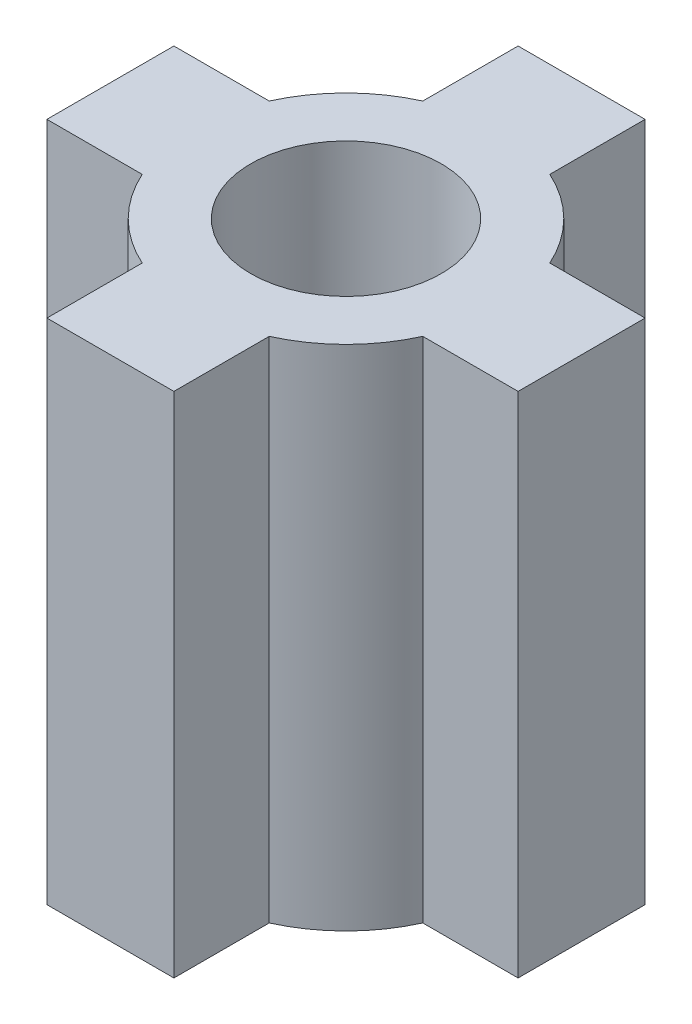
ISO-10303-21;
HEADER;
FILE_DESCRIPTION(('STEP AP214'),'2;1');
FILE_NAME('part.step','',(''),(''),'','','');
FILE_SCHEMA(('AUTOMOTIVE_DESIGN { 1 0 10303 214 1 1 1 1 }'));
ENDSEC;
DATA;
#1=APPLICATION_CONTEXT('core data for automotive mechanical design processes');
#2=APPLICATION_PROTOCOL_DEFINITION('international standard','automotive_design',2000,#1);
#3=PRODUCT_CONTEXT('',#1,'mechanical');
#4=PRODUCT('Part','Part','',(#3));
#5=PRODUCT_RELATED_PRODUCT_CATEGORY('part','',(#4));
#6=PRODUCT_DEFINITION_FORMATION('','',#4);
#7=PRODUCT_DEFINITION_CONTEXT('part definition',#1,'design');
#8=PRODUCT_DEFINITION('design','',#6,#7);
#9=PRODUCT_DEFINITION_SHAPE('','',#8);
#10=(LENGTH_UNIT() NAMED_UNIT(*) SI_UNIT(.MILLI.,.METRE.));
#11=(NAMED_UNIT(*) PLANE_ANGLE_UNIT() SI_UNIT($,.RADIAN.));
#12=(NAMED_UNIT(*) SI_UNIT($,.STERADIAN.) SOLID_ANGLE_UNIT());
#13=UNCERTAINTY_MEASURE_WITH_UNIT(LENGTH_MEASURE(1.E-05),#10,'distance_accuracy_value','');
#14=(GEOMETRIC_REPRESENTATION_CONTEXT(3) GLOBAL_UNCERTAINTY_ASSIGNED_CONTEXT((#13)) GLOBAL_UNIT_ASSIGNED_CONTEXT((#10,
#11,#12)) REPRESENTATION_CONTEXT('',''));
#15=CARTESIAN_POINT('',(0.,0.,0.));
#16=DIRECTION('',(0.,0.,1.));
#17=DIRECTION('',(1.,0.,0.));
#18=AXIS2_PLACEMENT_3D('',#15,#16,#17);
#19=CARTESIAN_POINT('',(0.,8.,0.));
#20=DIRECTION('',(0.,-1.,0.));
#21=DIRECTION('',(0.,0.,-1.));
#22=AXIS2_PLACEMENT_3D('',#19,#20,#21);
#23=CYLINDRICAL_SURFACE('',#22,1.5);
#24=CARTESIAN_POINT('',(0.,8.,0.));
#25=DIRECTION('',(0.,1.,0.));
#26=DIRECTION('',(0.,0.,1.));
#27=AXIS2_PLACEMENT_3D('',#24,#25,#26);
#28=CIRCLE('',#27,1.5);
#29=CARTESIAN_POINT('',(0.,8.,1.5));
#30=VERTEX_POINT('',#29);
#31=EDGE_CURVE('E178',#30,#30,#28,.T.);
#32=ORIENTED_EDGE('',*,*,#31,.T.);
#33=EDGE_LOOP('',(#32));
#34=FACE_BOUND('',#33,.T.);
#35=DIRECTION('',(0.,-1.,0.));
#36=VECTOR('',#35,1.);
#37=CARTESIAN_POINT('',(-0.53851648071345,1.25,-1.4));
#38=LINE('',#37,#36);
#39=CARTESIAN_POINT('',(-0.53851648071345,1.35,-1.4));
#40=VERTEX_POINT('',#39);
#41=CARTESIAN_POINT('',(-0.538516480713451,0.,-1.4));
#42=VERTEX_POINT('',#41);
#43=EDGE_CURVE('E61',#40,#42,#38,.T.);
#44=ORIENTED_EDGE('',*,*,#43,.F.);
#45=CARTESIAN_POINT('',(0.,1.35,0.));
#46=DIRECTION('',(0.,1.,0.));
#47=DIRECTION('',(0.,0.,1.));
#48=AXIS2_PLACEMENT_3D('',#45,#46,#47);
#49=CIRCLE('',#48,1.5);
#50=CARTESIAN_POINT('',(0.53851648071345,1.35,-1.4));
#51=VERTEX_POINT('',#50);
#52=EDGE_CURVE('E174',#40,#51,#49,.F.);
#53=ORIENTED_EDGE('',*,*,#52,.T.);
#54=DIRECTION('',(0.,-1.,0.));
#55=VECTOR('',#54,1.);
#56=CARTESIAN_POINT('',(0.53851648071345,1.25,-1.4));
#57=LINE('',#56,#55);
#58=CARTESIAN_POINT('',(0.53851648071345,0.,-1.4));
#59=VERTEX_POINT('',#58);
#60=EDGE_CURVE('E168',#51,#59,#57,.T.);
#61=ORIENTED_EDGE('',*,*,#60,.T.);
#62=CARTESIAN_POINT('',(0.,0.,0.));
#63=DIRECTION('',(0.,1.,0.));
#64=DIRECTION('',(0.,0.,1.));
#65=AXIS2_PLACEMENT_3D('',#62,#63,#64);
#66=CIRCLE('',#65,1.5);
#67=EDGE_CURVE('E172',#42,#59,#66,.T.);
#68=ORIENTED_EDGE('',*,*,#67,.F.);
#69=EDGE_LOOP('',(#44,#53,#61,#68));
#70=FACE_BOUND('',#69,.T.);
#71=ADVANCED_FACE('F35',(#34,#70),#23,.F.);
#72=CARTESIAN_POINT('',(0.,8.,0.));
#73=DIRECTION('',(0.,-1.,0.));
#74=DIRECTION('',(0.,0.,-1.));
#75=AXIS2_PLACEMENT_3D('',#72,#73,#74);
#76=CYLINDRICAL_SURFACE('',#75,2.425);
#77=CARTESIAN_POINT('',(0.,0.,0.));
#78=DIRECTION('',(0.,1.,0.));
#79=DIRECTION('',(0.,0.,1.));
#80=AXIS2_PLACEMENT_3D('',#77,#78,#79);
#81=CIRCLE('',#80,2.425);
#82=CARTESIAN_POINT('',(0.999999999999977,0.,2.20921366101155));
#83=VERTEX_POINT('',#82);
#84=CARTESIAN_POINT('',(2.20921366101154,0.,1.));
#85=VERTEX_POINT('',#84);
#86=EDGE_CURVE('E193',#83,#85,#81,.T.);
#87=ORIENTED_EDGE('',*,*,#86,.T.);
#88=DIRECTION('',(0.,1.,0.));
#89=VECTOR('',#88,1.);
#90=CARTESIAN_POINT('',(2.20921366101154,-2.50047188252426,1.));
#91=LINE('',#90,#89);
#92=CARTESIAN_POINT('',(2.20921366101154,8.,1.));
#93=VERTEX_POINT('',#92);
#94=EDGE_CURVE('E249',#85,#93,#91,.T.);
#95=ORIENTED_EDGE('',*,*,#94,.T.);
#96=CARTESIAN_POINT('',(0.,8.,0.));
#97=DIRECTION('',(0.,1.,0.));
#98=DIRECTION('',(0.,0.,1.));
#99=AXIS2_PLACEMENT_3D('',#96,#97,#98);
#100=CIRCLE('',#99,2.425);
#101=CARTESIAN_POINT('',(0.999999999999977,8.,2.20921366101155));
#102=VERTEX_POINT('',#101);
#103=EDGE_CURVE('E190',#102,#93,#100,.T.);
#104=ORIENTED_EDGE('',*,*,#103,.F.);
#105=DIRECTION('',(0.,1.,0.));
#106=VECTOR('',#105,1.);
#107=CARTESIAN_POINT('',(0.999999999999977,-2.50047188252426,2.20921366101155));
#108=LINE('',#107,#106);
#109=EDGE_CURVE('E265',#83,#102,#108,.T.);
#110=ORIENTED_EDGE('',*,*,#109,.F.);
#111=EDGE_LOOP('',(#87,#95,#104,#110));
#112=FACE_BOUND('',#111,.T.);
#113=ADVANCED_FACE('F302',(#112),#76,.T.);
#114=CARTESIAN_POINT('',(-1.00000000000004,-2.50047188252426,3.70999999999999));
#115=DIRECTION('',(-1.,0.,0.));
#116=DIRECTION('',(0.,0.,1.));
#117=AXIS2_PLACEMENT_3D('',#114,#115,#116);
#118=PLANE('',#117);
#119=DIRECTION('',(0.,0.,-1.));
#120=VECTOR('',#119,1.);
#121=CARTESIAN_POINT('',(-1.00000000000004,0.,3.70999999999999));
#122=LINE('',#121,#120);
#123=CARTESIAN_POINT('',(-1.00000000000004,0.,3.70999999999999));
#124=VERTEX_POINT('',#123);
#125=CARTESIAN_POINT('',(-1.00000000000002,0.,2.20921366101153));
#126=VERTEX_POINT('',#125);
#127=EDGE_CURVE('E271',#124,#126,#122,.T.);
#128=ORIENTED_EDGE('',*,*,#127,.F.);
#129=DIRECTION('',(0.,1.,0.));
#130=VECTOR('',#129,1.);
#131=CARTESIAN_POINT('',(-1.00000000000004,-2.50047188252426,3.70999999999999));
#132=LINE('',#131,#130);
#133=CARTESIAN_POINT('',(-1.00000000000004,8.,3.70999999999999));
#134=VERTEX_POINT('',#133);
#135=EDGE_CURVE('E259',#124,#134,#132,.T.);
#136=ORIENTED_EDGE('',*,*,#135,.T.);
#137=DIRECTION('',(0.,0.,1.));
#138=VECTOR('',#137,1.);
#139=CARTESIAN_POINT('',(-1.00000000000004,8.,3.70999999999999));
#140=LINE('',#139,#138);
#141=CARTESIAN_POINT('',(-1.00000000000002,8.,2.20921366101153));
#142=VERTEX_POINT('',#141);
#143=EDGE_CURVE('E274',#142,#134,#140,.T.);
#144=ORIENTED_EDGE('',*,*,#143,.F.);
#145=DIRECTION('',(0.,1.,0.));
#146=VECTOR('',#145,1.);
#147=CARTESIAN_POINT('',(-1.00000000000002,-2.50047188252426,2.20921366101153));
#148=LINE('',#147,#146);
#149=EDGE_CURVE('E277',#126,#142,#148,.T.);
#150=ORIENTED_EDGE('',*,*,#149,.F.);
#151=EDGE_LOOP('',(#128,#136,#144,#150));
#152=FACE_BOUND('',#151,.T.);
#153=ADVANCED_FACE('F346',(#152),#118,.T.);
#154=CARTESIAN_POINT('',(0.999999999999962,-2.50047188252426,3.71000000000001));
#155=DIRECTION('',(1.,0.,0.));
#156=DIRECTION('',(0.,0.,-1.));
#157=AXIS2_PLACEMENT_3D('',#154,#155,#156);
#158=PLANE('',#157);
#159=DIRECTION('',(0.,0.,1.));
#160=VECTOR('',#159,1.);
#161=CARTESIAN_POINT('',(0.999999999999962,0.,3.71000000000001));
#162=LINE('',#161,#160);
#163=CARTESIAN_POINT('',(0.999999999999962,0.,3.71000000000001));
#164=VERTEX_POINT('',#163);
#165=EDGE_CURVE('E262',#83,#164,#162,.T.);
#166=ORIENTED_EDGE('',*,*,#165,.F.);
#167=ORIENTED_EDGE('',*,*,#109,.T.);
#168=DIRECTION('',(0.,0.,-1.));
#169=VECTOR('',#168,1.);
#170=CARTESIAN_POINT('',(0.999999999999962,8.,3.71000000000001));
#171=LINE('',#170,#169);
#172=CARTESIAN_POINT('',(0.999999999999962,8.,3.71000000000001));
#173=VERTEX_POINT('',#172);
#174=EDGE_CURVE('E268',#173,#102,#171,.T.);
#175=ORIENTED_EDGE('',*,*,#174,.F.);
#176=DIRECTION('',(0.,1.,0.));
#177=VECTOR('',#176,1.);
#178=CARTESIAN_POINT('',(0.999999999999962,-2.50047188252426,3.71000000000001));
#179=LINE('',#178,#177);
#180=EDGE_CURVE('E254',#164,#173,#179,.T.);
#181=ORIENTED_EDGE('',*,*,#180,.F.);
#182=EDGE_LOOP('',(#166,#167,#175,#181));
#183=FACE_BOUND('',#182,.T.);
#184=ADVANCED_FACE('F343',(#183),#158,.T.);
#185=CARTESIAN_POINT('',(0.999999999999962,-2.50047188252426,3.71000000000001));
#186=DIRECTION('',(0.,0.,1.));
#187=DIRECTION('',(1.,0.,0.));
#188=AXIS2_PLACEMENT_3D('',#185,#186,#187);
#189=PLANE('',#188);
#190=DIRECTION('',(-1.,0.,0.));
#191=VECTOR('',#190,1.);
#192=CARTESIAN_POINT('',(0.999999999999962,0.,3.71000000000001));
#193=LINE('',#192,#191);
#194=EDGE_CURVE('E252',#164,#124,#193,.T.);
#195=ORIENTED_EDGE('',*,*,#194,.F.);
#196=ORIENTED_EDGE('',*,*,#180,.T.);
#197=DIRECTION('',(1.,0.,0.));
#198=VECTOR('',#197,1.);
#199=CARTESIAN_POINT('',(0.999999999999962,8.,3.71000000000001));
#200=LINE('',#199,#198);
#201=EDGE_CURVE('E256',#134,#173,#200,.T.);
#202=ORIENTED_EDGE('',*,*,#201,.F.);
#203=ORIENTED_EDGE('',*,*,#135,.F.);
#204=EDGE_LOOP('',(#195,#196,#202,#203));
#205=FACE_BOUND('',#204,.T.);
#206=ADVANCED_FACE('F340',(#205),#189,.T.);
#207=CARTESIAN_POINT('',(2.20921366101154,0.,-1.));
#208=VERTEX_POINT('',#207);
#209=CARTESIAN_POINT('',(1.00000000000001,0.,-2.20921366101153));
#210=VERTEX_POINT('',#209);
#211=EDGE_CURVE('E222',#208,#210,#81,.T.);
#212=ORIENTED_EDGE('',*,*,#211,.T.);
#213=DIRECTION('',(0.,1.,0.));
#214=VECTOR('',#213,1.);
#215=CARTESIAN_POINT('',(1.00000000000001,-2.50047188252426,-2.20921366101153));
#216=LINE('',#215,#214);
#217=CARTESIAN_POINT('',(1.00000000000001,8.,-2.20921366101153));
#218=VERTEX_POINT('',#217);
#219=EDGE_CURVE('E219',#210,#218,#216,.T.);
#220=ORIENTED_EDGE('',*,*,#219,.T.);
#221=CARTESIAN_POINT('',(2.20921366101154,8.,-1.));
#222=VERTEX_POINT('',#221);
#223=EDGE_CURVE('E226',#222,#218,#100,.T.);
#224=ORIENTED_EDGE('',*,*,#223,.F.);
#225=DIRECTION('',(0.,1.,0.));
#226=VECTOR('',#225,1.);
#227=CARTESIAN_POINT('',(2.20921366101154,-2.50047188252426,-1.));
#228=LINE('',#227,#226);
#229=EDGE_CURVE('E237',#208,#222,#228,.T.);
#230=ORIENTED_EDGE('',*,*,#229,.F.);
#231=EDGE_LOOP('',(#212,#220,#224,#230));
#232=FACE_BOUND('',#231,.T.);
#233=ADVANCED_FACE('F338',(#232),#76,.T.);
#234=CARTESIAN_POINT('',(3.71,-2.50047188252426,1.));
#235=DIRECTION('',(0.,0.,1.));
#236=DIRECTION('',(1.,0.,0.));
#237=AXIS2_PLACEMENT_3D('',#234,#235,#236);
#238=PLANE('',#237);
#239=DIRECTION('',(-1.,0.,0.));
#240=VECTOR('',#239,1.);
#241=CARTESIAN_POINT('',(3.71,0.,1.));
#242=LINE('',#241,#240);
#243=CARTESIAN_POINT('',(3.71,0.,0.999999999999999));
#244=VERTEX_POINT('',#243);
#245=EDGE_CURVE('E243',#244,#85,#242,.T.);
#246=ORIENTED_EDGE('',*,*,#245,.F.);
#247=DIRECTION('',(0.,1.,0.));
#248=VECTOR('',#247,1.);
#249=CARTESIAN_POINT('',(3.71,-2.50047188252426,1.));
#250=LINE('',#249,#248);
#251=CARTESIAN_POINT('',(3.71,8.,1.));
#252=VERTEX_POINT('',#251);
#253=EDGE_CURVE('E231',#244,#252,#250,.T.);
#254=ORIENTED_EDGE('',*,*,#253,.T.);
#255=DIRECTION('',(1.,0.,0.));
#256=VECTOR('',#255,1.);
#257=CARTESIAN_POINT('',(3.71,8.,1.));
#258=LINE('',#257,#256);
#259=EDGE_CURVE('E246',#93,#252,#258,.T.);
#260=ORIENTED_EDGE('',*,*,#259,.F.);
#261=ORIENTED_EDGE('',*,*,#94,.F.);
#262=EDGE_LOOP('',(#246,#254,#260,#261));
#263=FACE_BOUND('',#262,.T.);
#264=ADVANCED_FACE('F334',(#263),#238,.T.);
#265=CARTESIAN_POINT('',(3.71,-2.50047188252426,-1.));
#266=DIRECTION('',(0.,0.,-1.));
#267=DIRECTION('',(-1.,0.,0.));
#268=AXIS2_PLACEMENT_3D('',#265,#266,#267);
#269=PLANE('',#268);
#270=DIRECTION('',(1.,0.,0.));
#271=VECTOR('',#270,1.);
#272=CARTESIAN_POINT('',(3.71,0.,-1.));
#273=LINE('',#272,#271);
#274=CARTESIAN_POINT('',(3.71,0.,-1.));
#275=VERTEX_POINT('',#274);
#276=EDGE_CURVE('E234',#208,#275,#273,.T.);
#277=ORIENTED_EDGE('',*,*,#276,.F.);
#278=ORIENTED_EDGE('',*,*,#229,.T.);
#279=DIRECTION('',(-1.,0.,0.));
#280=VECTOR('',#279,1.);
#281=CARTESIAN_POINT('',(3.71,8.,-1.));
#282=LINE('',#281,#280);
#283=CARTESIAN_POINT('',(3.71,8.,-1.));
#284=VERTEX_POINT('',#283);
#285=EDGE_CURVE('E240',#284,#222,#282,.T.);
#286=ORIENTED_EDGE('',*,*,#285,.F.);
#287=DIRECTION('',(0.,1.,0.));
#288=VECTOR('',#287,1.);
#289=CARTESIAN_POINT('',(3.71,-2.50047188252426,-1.));
#290=LINE('',#289,#288);
#291=EDGE_CURVE('E225',#275,#284,#290,.T.);
#292=ORIENTED_EDGE('',*,*,#291,.F.);
#293=EDGE_LOOP('',(#277,#278,#286,#292));
#294=FACE_BOUND('',#293,.T.);
#295=ADVANCED_FACE('F330',(#294),#269,.T.);
#296=CARTESIAN_POINT('',(3.71,-2.50047188252426,-1.));
#297=DIRECTION('',(1.,0.,0.));
#298=DIRECTION('',(0.,0.,-1.));
#299=AXIS2_PLACEMENT_3D('',#296,#297,#298);
#300=PLANE('',#299);
#301=DIRECTION('',(0.,0.,1.));
#302=VECTOR('',#301,1.);
#303=CARTESIAN_POINT('',(3.71,0.,-1.));
#304=LINE('',#303,#302);
#305=EDGE_CURVE('E223',#275,#244,#304,.T.);
#306=ORIENTED_EDGE('',*,*,#305,.F.);
#307=ORIENTED_EDGE('',*,*,#291,.T.);
#308=DIRECTION('',(0.,0.,-1.));
#309=VECTOR('',#308,1.);
#310=CARTESIAN_POINT('',(3.71,8.,-1.));
#311=LINE('',#310,#309);
#312=EDGE_CURVE('E228',#252,#284,#311,.T.);
#313=ORIENTED_EDGE('',*,*,#312,.F.);
#314=ORIENTED_EDGE('',*,*,#253,.F.);
#315=EDGE_LOOP('',(#306,#307,#313,#314));
#316=FACE_BOUND('',#315,.T.);
#317=ADVANCED_FACE('F327',(#316),#300,.T.);
#318=CARTESIAN_POINT('',(-0.999999999999993,0.,-2.20921366101154));
#319=VERTEX_POINT('',#318);
#320=CARTESIAN_POINT('',(-2.20921366101154,0.,-1.));
#321=VERTEX_POINT('',#320);
#322=EDGE_CURVE('E189',#319,#321,#81,.T.);
#323=ORIENTED_EDGE('',*,*,#322,.T.);
#324=DIRECTION('',(0.,1.,0.));
#325=VECTOR('',#324,1.);
#326=CARTESIAN_POINT('',(-2.20921366101154,-2.50047188252426,-1.));
#327=LINE('',#326,#325);
#328=CARTESIAN_POINT('',(-2.20921366101154,8.,-1.));
#329=VERTEX_POINT('',#328);
#330=EDGE_CURVE('E373',#321,#329,#327,.T.);
#331=ORIENTED_EDGE('',*,*,#330,.T.);
#332=CARTESIAN_POINT('',(-0.999999999999993,8.,-2.20921366101154));
#333=VERTEX_POINT('',#332);
#334=EDGE_CURVE('E191',#333,#329,#100,.T.);
#335=ORIENTED_EDGE('',*,*,#334,.F.);
#336=DIRECTION('',(0.,1.,0.));
#337=VECTOR('',#336,1.);
#338=CARTESIAN_POINT('',(-0.999999999999993,-2.50047188252426,-2.20921366101154));
#339=LINE('',#338,#337);
#340=EDGE_CURVE('E207',#319,#333,#339,.T.);
#341=ORIENTED_EDGE('',*,*,#340,.F.);
#342=EDGE_LOOP('',(#323,#331,#335,#341));
#343=FACE_BOUND('',#342,.T.);
#344=ADVANCED_FACE('F315',(#343),#76,.T.);
#345=CARTESIAN_POINT('',(1.00000000000001,-2.50047188252426,-3.71));
#346=DIRECTION('',(1.,0.,0.));
#347=DIRECTION('',(0.,0.,-1.));
#348=AXIS2_PLACEMENT_3D('',#345,#346,#347);
#349=PLANE('',#348);
#350=DIRECTION('',(0.,0.,1.));
#351=VECTOR('',#350,1.);
#352=CARTESIAN_POINT('',(1.00000000000001,0.,-3.71));
#353=LINE('',#352,#351);
#354=CARTESIAN_POINT('',(1.00000000000001,0.,-3.71));
#355=VERTEX_POINT('',#354);
#356=EDGE_CURVE('E213',#355,#210,#353,.T.);
#357=ORIENTED_EDGE('',*,*,#356,.F.);
#358=DIRECTION('',(0.,1.,0.));
#359=VECTOR('',#358,1.);
#360=CARTESIAN_POINT('',(1.00000000000001,-2.50047188252426,-3.71));
#361=LINE('',#360,#359);
#362=CARTESIAN_POINT('',(1.00000000000001,8.,-3.71));
#363=VERTEX_POINT('',#362);
#364=EDGE_CURVE('E201',#355,#363,#361,.T.);
#365=ORIENTED_EDGE('',*,*,#364,.T.);
#366=DIRECTION('',(0.,0.,-1.));
#367=VECTOR('',#366,1.);
#368=CARTESIAN_POINT('',(1.00000000000001,8.,-3.71));
#369=LINE('',#368,#367);
#370=EDGE_CURVE('E216',#218,#363,#369,.T.);
#371=ORIENTED_EDGE('',*,*,#370,.F.);
#372=ORIENTED_EDGE('',*,*,#219,.F.);
#373=EDGE_LOOP('',(#357,#365,#371,#372));
#374=FACE_BOUND('',#373,.T.);
#375=ADVANCED_FACE('F322',(#374),#349,.T.);
#376=CARTESIAN_POINT('',(-0.999999999999987,-2.50047188252426,-3.71));
#377=DIRECTION('',(-1.,0.,0.));
#378=DIRECTION('',(0.,0.,1.));
#379=AXIS2_PLACEMENT_3D('',#376,#377,#378);
#380=PLANE('',#379);
#381=DIRECTION('',(0.,0.,-1.));
#382=VECTOR('',#381,1.);
#383=CARTESIAN_POINT('',(-0.999999999999987,0.,-3.71));
#384=LINE('',#383,#382);
#385=CARTESIAN_POINT('',(-0.999999999999987,0.,-3.71));
#386=VERTEX_POINT('',#385);
#387=EDGE_CURVE('E204',#319,#386,#384,.T.);
#388=ORIENTED_EDGE('',*,*,#387,.F.);
#389=ORIENTED_EDGE('',*,*,#340,.T.);
#390=DIRECTION('',(0.,0.,1.));
#391=VECTOR('',#390,1.);
#392=CARTESIAN_POINT('',(-0.999999999999987,8.,-3.71));
#393=LINE('',#392,#391);
#394=CARTESIAN_POINT('',(-0.999999999999987,8.,-3.71));
#395=VERTEX_POINT('',#394);
#396=EDGE_CURVE('E210',#395,#333,#393,.T.);
#397=ORIENTED_EDGE('',*,*,#396,.F.);
#398=DIRECTION('',(0.,1.,0.));
#399=VECTOR('',#398,1.);
#400=CARTESIAN_POINT('',(-0.999999999999987,-2.50047188252426,-3.71));
#401=LINE('',#400,#399);
#402=EDGE_CURVE('E196',#386,#395,#401,.T.);
#403=ORIENTED_EDGE('',*,*,#402,.F.);
#404=EDGE_LOOP('',(#388,#389,#397,#403));
#405=FACE_BOUND('',#404,.T.);
#406=ADVANCED_FACE('F318',(#405),#380,.T.);
#407=CARTESIAN_POINT('',(-0.999999999999987,-2.50047188252426,-3.71));
#408=DIRECTION('',(0.,0.,-1.));
#409=DIRECTION('',(-1.,0.,0.));
#410=AXIS2_PLACEMENT_3D('',#407,#408,#409);
#411=PLANE('',#410);
#412=DIRECTION('',(1.,0.,0.));
#413=VECTOR('',#412,1.);
#414=CARTESIAN_POINT('',(-0.999999999999987,0.,-3.71));
#415=LINE('',#414,#413);
#416=EDGE_CURVE('E194',#386,#355,#415,.T.);
#417=ORIENTED_EDGE('',*,*,#416,.F.);
#418=ORIENTED_EDGE('',*,*,#402,.T.);
#419=DIRECTION('',(-1.,0.,0.));
#420=VECTOR('',#419,1.);
#421=CARTESIAN_POINT('',(-0.999999999999987,8.,-3.71));
#422=LINE('',#421,#420);
#423=EDGE_CURVE('E198',#363,#395,#422,.T.);
#424=ORIENTED_EDGE('',*,*,#423,.F.);
#425=ORIENTED_EDGE('',*,*,#364,.F.);
#426=EDGE_LOOP('',(#417,#418,#424,#425));
#427=FACE_BOUND('',#426,.T.);
#428=ADVANCED_FACE('F307',(#427),#411,.T.);
#429=CARTESIAN_POINT('',(0.,8.,0.));
#430=DIRECTION('',(0.,1.,0.));
#431=DIRECTION('',(0.,0.,1.));
#432=AXIS2_PLACEMENT_3D('',#429,#430,#431);
#433=PLANE('',#432);
#434=CARTESIAN_POINT('',(-2.20921366101154,8.,1.));
#435=VERTEX_POINT('',#434);
#436=EDGE_CURVE('E187',#435,#142,#100,.T.);
#437=ORIENTED_EDGE('',*,*,#436,.T.);
#438=ORIENTED_EDGE('',*,*,#143,.T.);
#439=ORIENTED_EDGE('',*,*,#201,.T.);
#440=ORIENTED_EDGE('',*,*,#174,.T.);
#441=ORIENTED_EDGE('',*,*,#103,.T.);
#442=ORIENTED_EDGE('',*,*,#259,.T.);
#443=ORIENTED_EDGE('',*,*,#312,.T.);
#444=ORIENTED_EDGE('',*,*,#285,.T.);
#445=ORIENTED_EDGE('',*,*,#223,.T.);
#446=ORIENTED_EDGE('',*,*,#370,.T.);
#447=ORIENTED_EDGE('',*,*,#423,.T.);
#448=ORIENTED_EDGE('',*,*,#396,.T.);
#449=ORIENTED_EDGE('',*,*,#334,.T.);
#450=DIRECTION('',(-1.,0.,0.));
#451=VECTOR('',#450,1.);
#452=CARTESIAN_POINT('',(-3.71,8.,-1.));
#453=LINE('',#452,#451);
#454=CARTESIAN_POINT('',(-3.71,8.,-1.));
#455=VERTEX_POINT('',#454);
#456=EDGE_CURVE('E175',#329,#455,#453,.T.);
#457=ORIENTED_EDGE('',*,*,#456,.T.);
#458=DIRECTION('',(0.,0.,1.));
#459=VECTOR('',#458,1.);
#460=CARTESIAN_POINT('',(-3.71,8.,1.));
#461=LINE('',#460,#459);
#462=CARTESIAN_POINT('',(-3.71,8.,1.));
#463=VERTEX_POINT('',#462);
#464=EDGE_CURVE('E395',#455,#463,#461,.T.);
#465=ORIENTED_EDGE('',*,*,#464,.T.);
#466=DIRECTION('',(1.,0.,0.));
#467=VECTOR('',#466,1.);
#468=CARTESIAN_POINT('',(-3.71,8.,1.));
#469=LINE('',#468,#467);
#470=EDGE_CURVE('E388',#463,#435,#469,.T.);
#471=ORIENTED_EDGE('',*,*,#470,.T.);
#472=EDGE_LOOP('',(#437,#438,#439,#440,#441,#442,#443,#444,#445,#446,#447,#448,#449,#457,#465,#471));
#473=FACE_BOUND('',#472,.T.);
#474=ORIENTED_EDGE('',*,*,#31,.F.);
#475=EDGE_LOOP('',(#474));
#476=FACE_BOUND('',#475,.T.);
#477=ADVANCED_FACE('F304',(#473,#476),#433,.T.);
#478=CARTESIAN_POINT('',(0.,0.,0.));
#479=DIRECTION('',(0.,1.,0.));
#480=DIRECTION('',(0.,0.,1.));
#481=AXIS2_PLACEMENT_3D('',#478,#479,#480);
#482=PLANE('',#481);
#483=CARTESIAN_POINT('',(-2.20921366101154,0.,1.));
#484=VERTEX_POINT('',#483);
#485=EDGE_CURVE('E182',#484,#126,#81,.T.);
#486=ORIENTED_EDGE('',*,*,#485,.F.);
#487=DIRECTION('',(-1.,0.,0.));
#488=VECTOR('',#487,1.);
#489=CARTESIAN_POINT('',(-3.71,0.,1.));
#490=LINE('',#489,#488);
#491=CARTESIAN_POINT('',(-3.71,0.,1.));
#492=VERTEX_POINT('',#491);
#493=EDGE_CURVE('E379',#484,#492,#490,.T.);
#494=ORIENTED_EDGE('',*,*,#493,.T.);
#495=DIRECTION('',(0.,0.,-1.));
#496=VECTOR('',#495,1.);
#497=CARTESIAN_POINT('',(-3.71,0.,1.));
#498=LINE('',#497,#496);
#499=CARTESIAN_POINT('',(-3.71,0.,-0.999999999999999));
#500=VERTEX_POINT('',#499);
#501=EDGE_CURVE('E179',#492,#500,#498,.T.);
#502=ORIENTED_EDGE('',*,*,#501,.T.);
#503=DIRECTION('',(1.,0.,0.));
#504=VECTOR('',#503,1.);
#505=CARTESIAN_POINT('',(-3.71,0.,-1.));
#506=LINE('',#505,#504);
#507=EDGE_CURVE('E184',#500,#321,#506,.T.);
#508=ORIENTED_EDGE('',*,*,#507,.T.);
#509=ORIENTED_EDGE('',*,*,#322,.F.);
#510=ORIENTED_EDGE('',*,*,#387,.T.);
#511=ORIENTED_EDGE('',*,*,#416,.T.);
#512=ORIENTED_EDGE('',*,*,#356,.T.);
#513=ORIENTED_EDGE('',*,*,#211,.F.);
#514=ORIENTED_EDGE('',*,*,#276,.T.);
#515=ORIENTED_EDGE('',*,*,#305,.T.);
#516=ORIENTED_EDGE('',*,*,#245,.T.);
#517=ORIENTED_EDGE('',*,*,#86,.F.);
#518=ORIENTED_EDGE('',*,*,#165,.T.);
#519=ORIENTED_EDGE('',*,*,#194,.T.);
#520=ORIENTED_EDGE('',*,*,#127,.T.);
#521=EDGE_LOOP('',(#486,#494,#502,#508,#509,#510,#511,#512,#513,#514,#515,#516,#517,#518,#519,#520));
#522=FACE_BOUND('',#521,.T.);
#523=ORIENTED_EDGE('',*,*,#67,.T.);
#524=DIRECTION('',(1.,0.,0.));
#525=VECTOR('',#524,1.);
#526=CARTESIAN_POINT('',(-0.538516480713451,0.,-1.4));
#527=LINE('',#526,#525);
#528=EDGE_CURVE('E165',#42,#59,#527,.T.);
#529=ORIENTED_EDGE('',*,*,#528,.F.);
#530=EDGE_LOOP('',(#523,#529));
#531=FACE_BOUND('',#530,.T.);
#532=ADVANCED_FACE('F177',(#522,#531),#482,.F.);
#533=ORIENTED_EDGE('',*,*,#485,.T.);
#534=ORIENTED_EDGE('',*,*,#149,.T.);
#535=ORIENTED_EDGE('',*,*,#436,.F.);
#536=DIRECTION('',(0.,1.,0.));
#537=VECTOR('',#536,1.);
#538=CARTESIAN_POINT('',(-2.20921366101154,-2.50047188252426,1.));
#539=LINE('',#538,#537);
#540=EDGE_CURVE('E381',#484,#435,#539,.T.);
#541=ORIENTED_EDGE('',*,*,#540,.F.);
#542=EDGE_LOOP('',(#533,#534,#535,#541));
#543=FACE_BOUND('',#542,.T.);
#544=ADVANCED_FACE('F298',(#543),#76,.T.);
#545=CARTESIAN_POINT('',(-3.71,-2.50047188252426,-1.));
#546=DIRECTION('',(0.,0.,-1.));
#547=DIRECTION('',(-1.,0.,0.));
#548=AXIS2_PLACEMENT_3D('',#545,#546,#547);
#549=PLANE('',#548);
#550=ORIENTED_EDGE('',*,*,#507,.F.);
#551=DIRECTION('',(0.,1.,0.));
#552=VECTOR('',#551,1.);
#553=CARTESIAN_POINT('',(-3.71,-2.50047188252426,-1.));
#554=LINE('',#553,#552);
#555=EDGE_CURVE('E392',#500,#455,#554,.T.);
#556=ORIENTED_EDGE('',*,*,#555,.T.);
#557=ORIENTED_EDGE('',*,*,#456,.F.);
#558=ORIENTED_EDGE('',*,*,#330,.F.);
#559=EDGE_LOOP('',(#550,#556,#557,#558));
#560=FACE_BOUND('',#559,.T.);
#561=ADVANCED_FACE('F291',(#560),#549,.T.);
#562=CARTESIAN_POINT('',(-3.71,-2.50047188252426,1.));
#563=DIRECTION('',(0.,0.,1.));
#564=DIRECTION('',(1.,0.,0.));
#565=AXIS2_PLACEMENT_3D('',#562,#563,#564);
#566=PLANE('',#565);
#567=ORIENTED_EDGE('',*,*,#493,.F.);
#568=ORIENTED_EDGE('',*,*,#540,.T.);
#569=ORIENTED_EDGE('',*,*,#470,.F.);
#570=DIRECTION('',(0.,1.,0.));
#571=VECTOR('',#570,1.);
#572=CARTESIAN_POINT('',(-3.71,-2.50047188252426,1.));
#573=LINE('',#572,#571);
#574=EDGE_CURVE('E385',#492,#463,#573,.T.);
#575=ORIENTED_EDGE('',*,*,#574,.F.);
#576=EDGE_LOOP('',(#567,#568,#569,#575));
#577=FACE_BOUND('',#576,.T.);
#578=ADVANCED_FACE('F287',(#577),#566,.T.);
#579=CARTESIAN_POINT('',(-3.71,-2.50047188252426,1.));
#580=DIRECTION('',(-1.,0.,0.));
#581=DIRECTION('',(0.,0.,1.));
#582=AXIS2_PLACEMENT_3D('',#579,#580,#581);
#583=PLANE('',#582);
#584=ORIENTED_EDGE('',*,*,#501,.F.);
#585=ORIENTED_EDGE('',*,*,#574,.T.);
#586=ORIENTED_EDGE('',*,*,#464,.F.);
#587=ORIENTED_EDGE('',*,*,#555,.F.);
#588=EDGE_LOOP('',(#584,#585,#586,#587));
#589=FACE_BOUND('',#588,.T.);
#590=ADVANCED_FACE('F286',(#589),#583,.T.);
#591=CARTESIAN_POINT('',(-0.538516480713451,1.25,-1.4));
#592=DIRECTION('',(0.,0.,-1.));
#593=DIRECTION('',(-1.,0.,0.));
#594=AXIS2_PLACEMENT_3D('',#591,#592,#593);
#595=PLANE('',#594);
#596=ORIENTED_EDGE('',*,*,#528,.T.);
#597=ORIENTED_EDGE('',*,*,#60,.F.);
#598=CARTESIAN_POINT('',(0.53851648071345,1.35,-1.4));
#599=CARTESIAN_POINT('',(0.538522919323573,1.34773305077112,-1.4));
#600=CARTESIAN_POINT('',(0.538302098130464,1.34547475753124,-1.4));
#601=CARTESIAN_POINT('',(0.537466339079226,1.3410606010107,-1.4));
#602=CARTESIAN_POINT('',(0.536856417588771,1.33890380388407,-1.4));
#603=CARTESIAN_POINT('',(0.53511764680767,1.33422654258698,-1.4));
#604=CARTESIAN_POINT('',(0.533900622356218,1.33173947460017,-1.4));
#605=CARTESIAN_POINT('',(0.53108076677976,1.32698493071266,-1.4));
#606=CARTESIAN_POINT('',(0.529475927991702,1.32471868658201,-1.4));
#607=CARTESIAN_POINT('',(0.524895517828058,1.3190539533,-1.4));
#608=CARTESIAN_POINT('',(0.52169309679586,1.31584096399649,-1.4));
#609=CARTESIAN_POINT('',(0.514865663373164,1.30991331923798,-1.4));
#610=CARTESIAN_POINT('',(0.511239866881199,1.30719961318568,-1.4));
#611=CARTESIAN_POINT('',(0.499619988578152,1.29940328426599,-1.4));
#612=CARTESIAN_POINT('',(0.491189662917471,1.29498010660302,-1.4));
#613=CARTESIAN_POINT('',(0.47384769385903,1.287234954889,-1.4));
#614=CARTESIAN_POINT('',(0.464934544094564,1.28391668908154,-1.4));
#615=CARTESIAN_POINT('',(0.43606412896831,1.27452703240026,-1.4));
#616=CARTESIAN_POINT('',(0.415643875763485,1.26990751871682,-1.4));
#617=CARTESIAN_POINT('',(0.374444061791151,1.26262454066344,-1.4));
#618=CARTESIAN_POINT('',(0.353663385134545,1.25996902931477,-1.4));
#619=CARTESIAN_POINT('',(0.311786786067831,1.25586356501148,-1.4));
#620=CARTESIAN_POINT('',(0.290689736321959,1.25442517551097,-1.4));
#621=CARTESIAN_POINT('',(0.248501716933893,1.25230399294136,-1.4));
#622=CARTESIAN_POINT('',(0.227410799222437,1.25161990478393,-1.4));
#623=CARTESIAN_POINT('',(0.188959179281574,1.25076294535855,-1.4));
#624=CARTESIAN_POINT('',(0.171599868560499,1.25052095708272,-1.4));
#625=CARTESIAN_POINT('',(0.136871876691354,1.25019780138314,-1.4));
#626=CARTESIAN_POINT('',(0.119503195014576,1.25011671052914,-1.4));
#627=CARTESIAN_POINT('',(0.0851076381010867,1.25002269860268,-1.4));
#628=CARTESIAN_POINT('',(0.068080764861942,1.25000846701044,-1.4));
#629=CARTESIAN_POINT('',(0.0340359159066899,1.25000019519227,-1.4));
#630=CARTESIAN_POINT('',(0.0170179401977369,1.25000614440287,-1.4));
#631=CARTESIAN_POINT('',(0.,1.25,-1.4));
#632=B_SPLINE_CURVE_WITH_KNOTS('',3,(#598,#599,#600,#601,#602,#603,#604,#605,#606,#607,#608,
#609,#610,#611,#612,#613,#614,#615,#616,#617,#618,#619,#620,#621,#622,#623,#624,#625,#626,#627,
#628,#629,#630,#631),.UNSPECIFIED.,.F.,.F.,(4,2,2,2,2,2,2,2,2,2,2,2,2,2,2,2,4),(0.,
0.00677616786679215,0.0134666942533665,0.0217269056778473,0.0300308314087456,0.043563057554637,
0.0571207555449581,0.0855226446583753,0.114018915806796,0.176586359354771,0.239405796441178,
0.302815564322172,0.366116291240336,0.418197860252346,0.470304208514917,0.521384827063231,
0.572438712032822),.UNSPECIFIED.);
#633=CARTESIAN_POINT('',(0.,1.25,-1.4));
#634=VERTEX_POINT('',#633);
#635=EDGE_CURVE('E11',#51,#634,#632,.T.);
#636=ORIENTED_EDGE('',*,*,#635,.T.);
#637=CARTESIAN_POINT('',(0.,1.25,-1.4));
#638=CARTESIAN_POINT('',(-0.0166592654779057,1.25000386483053,-1.4));
#639=CARTESIAN_POINT('',(-0.0333182658408458,1.24999929015258,-1.4));
#640=CARTESIAN_POINT('',(-0.0666374165552348,1.25000866271114,-1.4));
#641=CARTESIAN_POINT('',(-0.083297566905862,1.25002261123937,-1.4));
#642=CARTESIAN_POINT('',(-0.133307133354275,1.2501454247328,-1.4));
#643=CARTESIAN_POINT('',(-0.166657311333457,1.25033537163024,-1.4));
#644=CARTESIAN_POINT('',(-0.21879033455485,1.25139844480864,-1.4));
#645=CARTESIAN_POINT('',(-0.23757829057358,1.25193721631637,-1.4));
#646=CARTESIAN_POINT('',(-0.275131715803197,1.25355649860429,-1.4));
#647=CARTESIAN_POINT('',(-0.293897184588074,1.25463701949003,-1.4));
#648=CARTESIAN_POINT('',(-0.338330208509729,1.25818533757053,-1.4));
#649=CARTESIAN_POINT('',(-0.363973866139722,1.26101922971052,-1.4));
#650=CARTESIAN_POINT('',(-0.407211886716393,1.26828430385692,-1.4));
#651=CARTESIAN_POINT('',(-0.424914627003189,1.27198193131481,-1.4));
#652=CARTESIAN_POINT('',(-0.452041196630489,1.27960964166838,-1.4));
#653=CARTESIAN_POINT('',(-0.46169017828849,1.28272621622026,-1.4));
#654=CARTESIAN_POINT('',(-0.480570675821218,1.29002116735657,-1.4));
#655=CARTESIAN_POINT('',(-0.489803685754237,1.29419531514646,-1.4));
#656=CARTESIAN_POINT('',(-0.501888761845756,1.3010732154375,-1.4));
#657=CARTESIAN_POINT('',(-0.505136766632663,1.30307598331871,-1.4));
#658=CARTESIAN_POINT('',(-0.511445305207842,1.30737417287684,-1.4));
#659=CARTESIAN_POINT('',(-0.514505497487391,1.30967010557233,-1.4));
#660=CARTESIAN_POINT('',(-0.520367687228043,1.31463789519271,-1.4));
#661=CARTESIAN_POINT('',(-0.52316647087665,1.31731361286083,-1.4));
#662=CARTESIAN_POINT('',(-0.528291499812003,1.32308758433901,-1.4));
#663=CARTESIAN_POINT('',(-0.530619360031179,1.32618433104085,-1.4));
#664=CARTESIAN_POINT('',(-0.533733714258493,1.3314722162888,-1.4));
#665=CARTESIAN_POINT('',(-0.534762161202288,1.33351999361659,-1.4));
#666=CARTESIAN_POINT('',(-0.536479784580544,1.33775084846541,-1.4));
#667=CARTESIAN_POINT('',(-0.537169975089598,1.33993349920983,-1.4));
#668=CARTESIAN_POINT('',(-0.537940305099125,1.34344417402328,-1.4));
#669=CARTESIAN_POINT('',(-0.538154992852305,1.3447434749346,-1.4));
#670=CARTESIAN_POINT('',(-0.538443669196526,1.34736145327663,-1.4));
#671=CARTESIAN_POINT('',(-0.538517235478057,1.34868017700268,-1.4));
#672=CARTESIAN_POINT('',(-0.538516480714914,1.34999999999968,-1.4));
#673=B_SPLINE_CURVE_WITH_KNOTS('',3,(#637,#638,#639,#640,#641,#642,#643,#644,#645,#646,#647,
#648,#649,#650,#651,#652,#653,#654,#655,#656,#657,#658,#659,#660,#661,#662,#663,#664,#665,#666,
#667,#668,#669,#670,#671,#672),.UNSPECIFIED.,.F.,.F.,(4,2,2,2,2,2,2,2,2,2,2,2,2,2,2,2,2,4),(0.,
0.0499772604703846,0.0999580062750993,0.200004562815047,0.256385986858175,0.312768462653414,
0.390082267074182,0.444217939216445,0.47460595337785,0.504874325084902,0.51631040779708,
0.527766704175375,0.539349138976861,0.550891154583442,0.557742934042205,0.564574044630555,
0.568517726847332,0.572473192332394),.UNSPECIFIED.);
#674=EDGE_CURVE('E48',#634,#40,#673,.T.);
#675=ORIENTED_EDGE('',*,*,#674,.T.);
#676=ORIENTED_EDGE('',*,*,#43,.T.);
#677=EDGE_LOOP('',(#596,#597,#636,#675,#676));
#678=FACE_BOUND('',#677,.T.);
#679=ADVANCED_FACE('F167',(#678),#595,.F.);
#680=CARTESIAN_POINT('',(0.,1.35,0.));
#681=DIRECTION('',(0.,1.,0.));
#682=DIRECTION('',(0.,0.,1.));
#683=AXIS2_PLACEMENT_3D('',#680,#681,#682);
#684=TOROIDAL_SURFACE('',#683,1.4,0.1);
#685=ORIENTED_EDGE('',*,*,#635,.F.);
#686=ORIENTED_EDGE('',*,*,#52,.F.);
#687=ORIENTED_EDGE('',*,*,#674,.F.);
#688=EDGE_LOOP('',(#685,#686,#687));
#689=FACE_BOUND('',#688,.T.);
#690=ADVANCED_FACE('F37',(#689),#684,.F.);
#691=CLOSED_SHELL('',(#71,#113,#153,#184,#206,#233,#264,#295,#317,#344,#375,#406,#428,#477,#532,
#544,#561,#578,#590,#679,#690));
#692=MANIFOLD_SOLID_BREP('B2',#691);
#693=ADVANCED_BREP_SHAPE_REPRESENTATION('',(#18,#692),#14);
#694=SHAPE_DEFINITION_REPRESENTATION(#9,#693);
ENDSEC;
END-ISO-10303-21;
